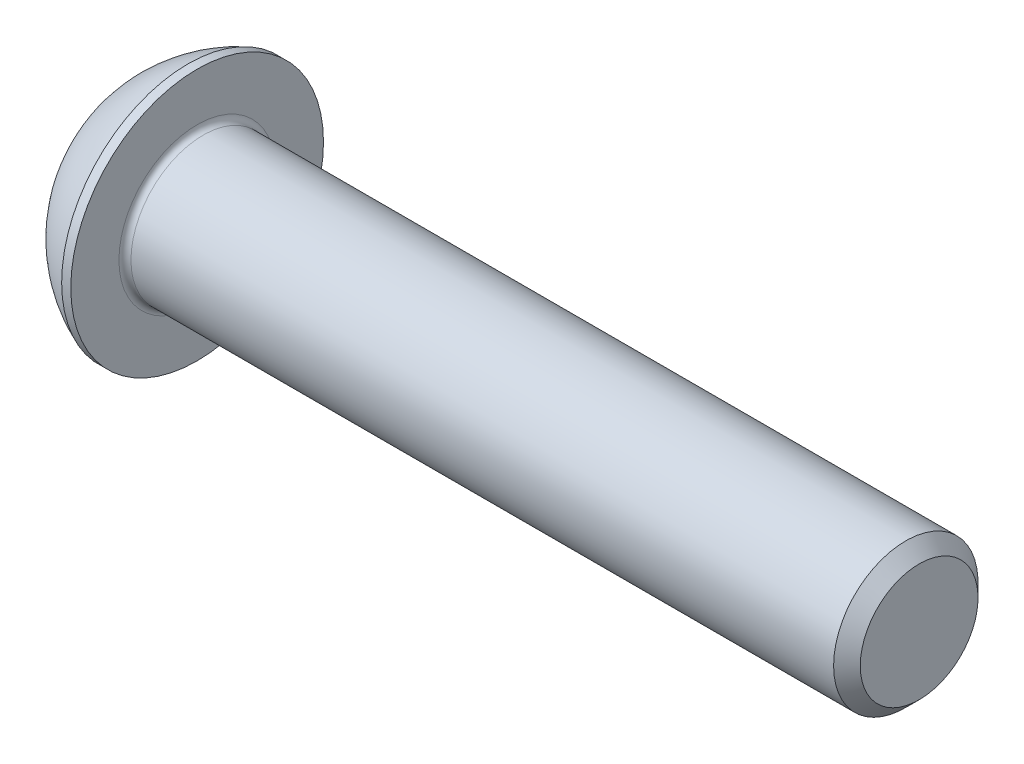
ISO-10303-21;
HEADER;
FILE_DESCRIPTION(('STEP AP214'),'2;1');
FILE_NAME('part.step','',(''),(''),'','','');
FILE_SCHEMA(('AUTOMOTIVE_DESIGN { 1 0 10303 214 1 1 1 1 }'));
ENDSEC;
DATA;
#1=APPLICATION_CONTEXT('core data for automotive mechanical design processes');
#2=APPLICATION_PROTOCOL_DEFINITION('international standard','automotive_design',2000,#1);
#3=PRODUCT_CONTEXT('',#1,'mechanical');
#4=PRODUCT('Part','Part','',(#3));
#5=PRODUCT_RELATED_PRODUCT_CATEGORY('part','',(#4));
#6=PRODUCT_DEFINITION_FORMATION('','',#4);
#7=PRODUCT_DEFINITION_CONTEXT('part definition',#1,'design');
#8=PRODUCT_DEFINITION('design','',#6,#7);
#9=PRODUCT_DEFINITION_SHAPE('','',#8);
#10=(LENGTH_UNIT() NAMED_UNIT(*) SI_UNIT(.MILLI.,.METRE.));
#11=(NAMED_UNIT(*) PLANE_ANGLE_UNIT() SI_UNIT($,.RADIAN.));
#12=(NAMED_UNIT(*) SI_UNIT($,.STERADIAN.) SOLID_ANGLE_UNIT());
#13=UNCERTAINTY_MEASURE_WITH_UNIT(LENGTH_MEASURE(1.E-05),#10,'distance_accuracy_value','');
#14=(GEOMETRIC_REPRESENTATION_CONTEXT(3) GLOBAL_UNCERTAINTY_ASSIGNED_CONTEXT((#13)) GLOBAL_UNIT_ASSIGNED_CONTEXT((#10,
#11,#12)) REPRESENTATION_CONTEXT('',''));
#15=CARTESIAN_POINT('',(0.,0.,0.));
#16=DIRECTION('',(0.,0.,1.));
#17=DIRECTION('',(1.,0.,0.));
#18=AXIS2_PLACEMENT_3D('',#15,#16,#17);
#19=CARTESIAN_POINT('',(0.,0.,0.));
#20=DIRECTION('',(-1.,0.,0.));
#21=DIRECTION('',(0.,0.,1.));
#22=AXIS2_PLACEMENT_3D('',#19,#20,#21);
#23=PLANE('',#22);
#24=CARTESIAN_POINT('',(0.,0.,0.));
#25=DIRECTION('',(-1.,0.,0.));
#26=DIRECTION('',(0.,0.,1.));
#27=AXIS2_PLACEMENT_3D('',#24,#25,#26);
#28=CIRCLE('',#27,2.625);
#29=CARTESIAN_POINT('',(0.,2.625,0.));
#30=VERTEX_POINT('',#29);
#31=EDGE_CURVE('E157',#30,#30,#28,.T.);
#32=ORIENTED_EDGE('',*,*,#31,.T.);
#33=EDGE_LOOP('',(#32));
#34=FACE_BOUND('',#33,.T.);
#35=DIRECTION('',(0.,-1.,0.));
#36=VECTOR('',#35,1.);
#37=CARTESIAN_POINT('',(0.,-1.15470053837925,2.));
#38=LINE('',#37,#36);
#39=CARTESIAN_POINT('',(0.,1.15470053837925,2.));
#40=VERTEX_POINT('',#39);
#41=CARTESIAN_POINT('',(0.,-1.15470053837925,2.));
#42=VERTEX_POINT('',#41);
#43=EDGE_CURVE('E52',#40,#42,#38,.T.);
#44=ORIENTED_EDGE('',*,*,#43,.T.);
#45=DIRECTION('',(0.,-0.5,-0.866025403784438));
#46=VECTOR('',#45,1.);
#47=CARTESIAN_POINT('',(0.,-2.3094010767585,0.));
#48=LINE('',#47,#46);
#49=CARTESIAN_POINT('',(0.,-2.3094010767585,0.));
#50=VERTEX_POINT('',#49);
#51=EDGE_CURVE('E277',#42,#50,#48,.T.);
#52=ORIENTED_EDGE('',*,*,#51,.T.);
#53=DIRECTION('',(0.,0.5,-0.866025403784438));
#54=VECTOR('',#53,1.);
#55=CARTESIAN_POINT('',(0.,-1.15470053837925,-2.));
#56=LINE('',#55,#54);
#57=CARTESIAN_POINT('',(0.,-1.15470053837925,-2.));
#58=VERTEX_POINT('',#57);
#59=EDGE_CURVE('E132',#50,#58,#56,.T.);
#60=ORIENTED_EDGE('',*,*,#59,.T.);
#61=DIRECTION('',(0.,1.,0.));
#62=VECTOR('',#61,1.);
#63=CARTESIAN_POINT('',(0.,1.15470053837925,-2.));
#64=LINE('',#63,#62);
#65=CARTESIAN_POINT('',(0.,1.15470053837925,-2.));
#66=VERTEX_POINT('',#65);
#67=EDGE_CURVE('E280',#58,#66,#64,.T.);
#68=ORIENTED_EDGE('',*,*,#67,.T.);
#69=DIRECTION('',(0.,0.5,0.866025403784439));
#70=VECTOR('',#69,1.);
#71=CARTESIAN_POINT('',(0.,2.3094010767585,0.));
#72=LINE('',#71,#70);
#73=CARTESIAN_POINT('',(0.,2.3094010767585,0.));
#74=VERTEX_POINT('',#73);
#75=EDGE_CURVE('E282',#66,#74,#72,.T.);
#76=ORIENTED_EDGE('',*,*,#75,.T.);
#77=DIRECTION('',(0.,-0.5,0.866025403784439));
#78=VECTOR('',#77,1.);
#79=CARTESIAN_POINT('',(0.,1.15470053837925,2.));
#80=LINE('',#79,#78);
#81=EDGE_CURVE('E284',#74,#40,#80,.T.);
#82=ORIENTED_EDGE('',*,*,#81,.T.);
#83=EDGE_LOOP('',(#44,#52,#60,#68,#76,#82));
#84=FACE_BOUND('',#83,.T.);
#85=ADVANCED_FACE('F37',(#34,#84),#23,.T.);
#86=CARTESIAN_POINT('',(4.99970462328768,0.,0.));
#87=DIRECTION('',(-1.,0.,0.));
#88=DIRECTION('',(0.,1.,0.));
#89=AXIS2_PLACEMENT_3D('',#86,#87,#88);
#90=SPHERICAL_SURFACE('',#89,5.64691697478581);
#91=CARTESIAN_POINT('',(2.92,0.,0.));
#92=DIRECTION('',(-1.,0.,0.));
#93=DIRECTION('',(0.,0.,1.));
#94=AXIS2_PLACEMENT_3D('',#91,#92,#93);
#95=CIRCLE('',#94,5.25);
#96=CARTESIAN_POINT('',(2.92,5.25,0.));
#97=VERTEX_POINT('',#96);
#98=EDGE_CURVE('E154',#97,#97,#95,.T.);
#99=CARTESIAN_POINT('',(2.92,5.25,0.));
#100=CARTESIAN_POINT('',(2.88116333139993,5.23461555496799,0.));
#101=CARTESIAN_POINT('',(2.84249743445724,5.21880002304115,0.));
#102=CARTESIAN_POINT('',(2.76552608609883,5.18631490596424,0.));
#103=CARTESIAN_POINT('',(2.72722063468312,5.16964532081416,0.));
#104=CARTESIAN_POINT('',(2.65098907959088,5.13546021785716,0.));
#105=CARTESIAN_POINT('',(2.61306297591435,5.11794470005024,0.));
#106=CARTESIAN_POINT('',(2.5376087841269,5.08207638165227,0.));
#107=CARTESIAN_POINT('',(2.50008069601598,5.06372358106122,0.));
#108=CARTESIAN_POINT('',(2.42544101991594,5.02618972911532,0.));
#109=CARTESIAN_POINT('',(2.38832943192683,5.00700867776048,0.));
#110=CARTESIAN_POINT('',(2.31454103209333,4.9678277722965,0.));
#111=CARTESIAN_POINT('',(2.27786422024896,4.94782791818736,0.));
#112=CARTESIAN_POINT('',(2.204963435524,4.90701925630078,0.));
#113=CARTESIAN_POINT('',(2.16873946264343,4.88621044852334,0.));
#114=CARTESIAN_POINT('',(2.09676219540546,4.84379412736126,0.));
#115=CARTESIAN_POINT('',(2.06100890104806,4.82218661397662,0.));
#116=CARTESIAN_POINT('',(1.9899905986814,4.77818352285276,0.));
#117=CARTESIAN_POINT('',(1.95472559067213,4.75578794511354,0.));
#118=CARTESIAN_POINT('',(1.88470122833741,4.7102197546814,0.));
#119=CARTESIAN_POINT('',(1.84994187401195,4.68704714198848,0.));
#120=CARTESIAN_POINT('',(1.78094593736053,4.63993629371345,0.));
#121=CARTESIAN_POINT('',(1.74670935503456,4.61599805813135,0.));
#122=CARTESIAN_POINT('',(1.67877582324134,4.56736775320002,0.));
#123=CARTESIAN_POINT('',(1.6450788737741,4.54267568385081,0.));
#124=CARTESIAN_POINT('',(1.57824120279908,4.4925498717552,0.));
#125=CARTESIAN_POINT('',(1.54510048129131,4.46711612900881,0.));
#126=CARTESIAN_POINT('',(1.4793915874043,4.4155194957489,0.));
#127=CARTESIAN_POINT('',(1.44682341502507,4.38935660523539,0.));
#128=CARTESIAN_POINT('',(1.3822756585948,4.33631456116252,0.));
#129=CARTESIAN_POINT('',(1.35029607454376,4.30943540760317,0.));
#130=CARTESIAN_POINT('',(1.28694124410103,4.2549740749057,0.));
#131=CARTESIAN_POINT('',(1.25556599770935,4.22739189576759,0.));
#132=CARTESIAN_POINT('',(1.19343529429185,4.17153809560631,0.));
#133=CARTESIAN_POINT('',(1.16267983726603,4.14326647458314,0.));
#134=CARTESIAN_POINT('',(1.10180385905236,4.0860477138823,0.));
#135=CARTESIAN_POINT('',(1.07168333786452,4.05710057420464,0.));
#136=CARTESIAN_POINT('',(1.01209206510523,3.99854503210539,0.));
#137=CARTESIAN_POINT('',(0.982621313533779,3.96893662968379,0.));
#138=CARTESIAN_POINT('',(0.924344093786626,3.90907314366641,0.));
#139=CARTESIAN_POINT('',(0.895537625610919,3.87881806007064,0.));
#140=CARTESIAN_POINT('',(0.838603159287822,3.8176761117527,0.));
#141=CARTESIAN_POINT('',(0.810475161140432,3.78678924703054,0.));
#142=CARTESIAN_POINT('',(0.754911487372878,3.72439894764781,0.));
#143=CARTESIAN_POINT('',(0.727475811752714,3.69289551298725,0.));
#144=CARTESIAN_POINT('',(0.673310294583733,3.62928758856414,0.));
#145=CARTESIAN_POINT('',(0.646580453034914,3.59718309880159,0.));
#146=CARTESIAN_POINT('',(0.593839767940169,3.53238887502059,0.));
#147=CARTESIAN_POINT('',(0.567828924394242,3.49969914100215,0.));
#148=CARTESIAN_POINT('',(0.516539045154726,3.43375052777114,0.));
#149=CARTESIAN_POINT('',(0.491260009461136,3.40049164855857,0.));
#150=CARTESIAN_POINT('',(0.441446195334815,3.33342112431611,0.));
#151=CARTESIAN_POINT('',(0.416911416902084,3.29960947928621,0.));
#152=CARTESIAN_POINT('',(0.368598200321404,3.23145007493057,0.));
#153=CARTESIAN_POINT('',(0.344819762173456,3.19710231560483,0.));
#154=CARTESIAN_POINT('',(0.298030936151543,3.12788759851044,0.));
#155=CARTESIAN_POINT('',(0.275020548277578,3.09302064074179,0.));
#156=CARTESIAN_POINT('',(0.229779156601617,3.02278469716988,0.));
#157=CARTESIAN_POINT('',(0.207548152799621,2.98741571136661,0.));
#158=CARTESIAN_POINT('',(0.163876471550352,2.91619313362712,0.));
#159=CARTESIAN_POINT('',(0.142435794103077,2.8803395416909,0.));
#160=CARTESIAN_POINT('',(0.100355347300805,2.80816539636944,0.));
#161=CARTESIAN_POINT('',(0.0797155779458075,2.7718448429842,0.));
#162=CARTESIAN_POINT('',(0.0392470276158929,2.69875470867178,0.));
#163=CARTESIAN_POINT('',(0.0194182466409761,2.66198512774461,0.));
#164=CARTESIAN_POINT('',(0.,2.625,0.));
#165=B_SPLINE_CURVE_WITH_KNOTS('',3,(#99,#100,#101,#102,#103,#104,#105,#106,#107,#108,#109,#110,
#111,#112,#113,#114,#115,#116,#117,#118,#119,#120,#121,#122,#123,#124,#125,#126,#127,#128,#129,
#130,#131,#132,#133,#134,#135,#136,#137,#138,#139,#140,#141,#142,#143,#144,#145,#146,#147,#148,
#149,#150,#151,#152,#153,#154,#155,#156,#157,#158,#159,#160,#161,#162,#163,#164),.UNSPECIFIED.,
.F.,.F.,(4,2,2,2,2,2,2,2,2,2,2,2,2,2,2,2,2,2,2,2,2,2,2,2,2,2,2,2,2,2,2,2,4),(0.,
0.12531586463099,0.25063172926198,0.37594759389297,0.50126345852396,0.62657932315495,
0.75189518778594,0.877211052416929,1.00252691704792,1.12784278167891,1.2531586463099,
1.37847451094089,1.50379037557188,1.62910624020287,1.75442210483386,1.87973796946485,
2.00505383409584,2.13036969872683,2.25568556335782,2.38100142798881,2.5063172926198,
2.63163315725079,2.75694902188178,2.88226488651277,3.00758075114376,3.13289661577475,
3.25821248040574,3.38352834503673,3.50884420966772,3.63416007429871,3.7594759389297,
3.88479180356069,4.01010766819168),.UNSPECIFIED.);
#166=EDGE_CURVE('BSEAM178',#97,#30,#165,.T.);
#167=ORIENTED_EDGE('',*,*,#98,.T.);
#168=ORIENTED_EDGE('',*,*,#31,.F.);
#169=ORIENTED_EDGE('',*,*,#166,.T.);
#170=ORIENTED_EDGE('',*,*,#166,.F.);
#171=EDGE_LOOP('',(#167,#169,#168,#170));
#172=FACE_BOUND('',#171,.T.);
#173=ADVANCED_FACE('F178',(#172),#90,.T.);
#174=CARTESIAN_POINT('',(0.,0.,0.));
#175=DIRECTION('',(-1.,0.,0.));
#176=DIRECTION('',(0.,0.,1.));
#177=AXIS2_PLACEMENT_3D('',#174,#175,#176);
#178=CYLINDRICAL_SURFACE('',#177,5.25);
#179=ORIENTED_EDGE('',*,*,#98,.F.);
#180=EDGE_LOOP('',(#179));
#181=FACE_BOUND('',#180,.T.);
#182=CARTESIAN_POINT('',(3.3,0.,0.));
#183=DIRECTION('',(-1.,0.,0.));
#184=DIRECTION('',(0.,0.,1.));
#185=AXIS2_PLACEMENT_3D('',#182,#183,#184);
#186=CIRCLE('',#185,5.25);
#187=CARTESIAN_POINT('',(3.3,0.,5.25));
#188=VERTEX_POINT('',#187);
#189=EDGE_CURVE('E151',#188,#188,#186,.T.);
#190=ORIENTED_EDGE('',*,*,#189,.T.);
#191=EDGE_LOOP('',(#190));
#192=FACE_BOUND('',#191,.T.);
#193=ADVANCED_FACE('F183',(#181,#192),#178,.T.);
#194=CARTESIAN_POINT('',(3.3,3.,0.));
#195=DIRECTION('',(-1.,0.,0.));
#196=DIRECTION('',(0.,0.,1.));
#197=AXIS2_PLACEMENT_3D('',#194,#195,#196);
#198=PLANE('',#197);
#199=CARTESIAN_POINT('',(3.3,0.,0.));
#200=DIRECTION('',(-1.,0.,0.));
#201=DIRECTION('',(0.,0.,1.));
#202=AXIS2_PLACEMENT_3D('',#199,#200,#201);
#203=CIRCLE('',#202,3.25);
#204=CARTESIAN_POINT('',(3.3,0.,3.25));
#205=VERTEX_POINT('',#204);
#206=EDGE_CURVE('E45',#205,#205,#203,.T.);
#207=ORIENTED_EDGE('',*,*,#206,.T.);
#208=EDGE_LOOP('',(#207));
#209=FACE_BOUND('',#208,.T.);
#210=ORIENTED_EDGE('',*,*,#189,.F.);
#211=EDGE_LOOP('',(#210));
#212=FACE_BOUND('',#211,.T.);
#213=ADVANCED_FACE('F162',(#209,#212),#198,.F.);
#214=CARTESIAN_POINT('',(0.,0.,0.));
#215=DIRECTION('',(-1.,0.,0.));
#216=DIRECTION('',(0.,0.,1.));
#217=AXIS2_PLACEMENT_3D('',#214,#215,#216);
#218=CYLINDRICAL_SURFACE('',#217,3.);
#219=CARTESIAN_POINT('',(3.55,0.,0.));
#220=DIRECTION('',(-1.,0.,0.));
#221=DIRECTION('',(0.,0.,1.));
#222=AXIS2_PLACEMENT_3D('',#219,#220,#221);
#223=CIRCLE('',#222,3.);
#224=CARTESIAN_POINT('',(3.55,0.,3.));
#225=VERTEX_POINT('',#224);
#226=EDGE_CURVE('E11',#225,#225,#223,.F.);
#227=ORIENTED_EDGE('',*,*,#226,.T.);
#228=EDGE_LOOP('',(#227));
#229=FACE_BOUND('',#228,.T.);
#230=CARTESIAN_POINT('',(32.7455,0.,0.));
#231=DIRECTION('',(-1.,0.,0.));
#232=DIRECTION('',(0.,0.,1.));
#233=AXIS2_PLACEMENT_3D('',#230,#231,#232);
#234=CIRCLE('',#233,3.);
#235=CARTESIAN_POINT('',(32.7455,0.,3.));
#236=VERTEX_POINT('',#235);
#237=EDGE_CURVE('E148',#236,#236,#234,.T.);
#238=ORIENTED_EDGE('',*,*,#237,.T.);
#239=EDGE_LOOP('',(#238));
#240=FACE_BOUND('',#239,.T.);
#241=ADVANCED_FACE('F192',(#229,#240),#218,.T.);
#242=CARTESIAN_POINT('',(33.3,0.,0.));
#243=DIRECTION('',(-1.,0.,0.));
#244=DIRECTION('',(0.,0.,1.));
#245=AXIS2_PLACEMENT_3D('',#242,#243,#244);
#246=CONICAL_SURFACE('',#245,2.4455,0.785398163397433);
#247=ORIENTED_EDGE('',*,*,#237,.F.);
#248=EDGE_LOOP('',(#247));
#249=FACE_BOUND('',#248,.T.);
#250=CARTESIAN_POINT('',(33.3,0.,0.));
#251=DIRECTION('',(-1.,0.,0.));
#252=DIRECTION('',(0.,0.,1.));
#253=AXIS2_PLACEMENT_3D('',#250,#251,#252);
#254=CIRCLE('',#253,2.4455);
#255=CARTESIAN_POINT('',(33.3,0.,2.4455));
#256=VERTEX_POINT('',#255);
#257=EDGE_CURVE('E144',#256,#256,#254,.T.);
#258=ORIENTED_EDGE('',*,*,#257,.T.);
#259=EDGE_LOOP('',(#258));
#260=FACE_BOUND('',#259,.T.);
#261=ADVANCED_FACE('F173',(#249,#260),#246,.T.);
#262=CARTESIAN_POINT('',(33.3,0.,0.));
#263=DIRECTION('',(-1.,0.,0.));
#264=DIRECTION('',(0.,0.,1.));
#265=AXIS2_PLACEMENT_3D('',#262,#263,#264);
#266=PLANE('',#265);
#267=ORIENTED_EDGE('',*,*,#257,.F.);
#268=EDGE_LOOP('',(#267));
#269=FACE_BOUND('',#268,.T.);
#270=ADVANCED_FACE('F166',(#269),#266,.F.);
#271=CARTESIAN_POINT('',(3.55,0.,0.));
#272=DIRECTION('',(-1.,0.,0.));
#273=DIRECTION('',(0.,0.,1.));
#274=AXIS2_PLACEMENT_3D('',#271,#272,#273);
#275=TOROIDAL_SURFACE('',#274,3.25,0.25);
#276=ORIENTED_EDGE('',*,*,#226,.F.);
#277=EDGE_LOOP('',(#276));
#278=FACE_BOUND('',#277,.T.);
#279=ORIENTED_EDGE('',*,*,#206,.F.);
#280=EDGE_LOOP('',(#279));
#281=FACE_BOUND('',#280,.T.);
#282=ADVANCED_FACE('F39',(#278,#281),#275,.F.);
#283=CARTESIAN_POINT('',(2.08,-2.3094010767585,0.));
#284=DIRECTION('',(0.,0.866025403784438,-0.500000000000001));
#285=DIRECTION('',(0.,0.500000000000001,0.866025403784438));
#286=AXIS2_PLACEMENT_3D('',#283,#284,#285);
#287=PLANE('',#286);
#288=DIRECTION('',(0.,-0.5,-0.866025403784438));
#289=VECTOR('',#288,1.);
#290=CARTESIAN_POINT('',(2.08,-2.3094010767585,0.));
#291=LINE('',#290,#289);
#292=CARTESIAN_POINT('',(2.08,-1.15470053837925,2.));
#293=VERTEX_POINT('',#292);
#294=CARTESIAN_POINT('',(2.08,-1.73205080756888,1.));
#295=VERTEX_POINT('',#294);
#296=EDGE_CURVE('E118',#293,#295,#291,.T.);
#297=ORIENTED_EDGE('',*,*,#296,.T.);
#298=CARTESIAN_POINT('',(2.08,-2.3094010767585,0.));
#299=VERTEX_POINT('',#298);
#300=EDGE_CURVE('E113',#295,#299,#291,.T.);
#301=ORIENTED_EDGE('',*,*,#300,.T.);
#302=DIRECTION('',(-1.,0.,0.));
#303=VECTOR('',#302,1.);
#304=CARTESIAN_POINT('',(2.08,-2.3094010767585,0.));
#305=LINE('',#304,#303);
#306=EDGE_CURVE('E115',#299,#50,#305,.T.);
#307=ORIENTED_EDGE('',*,*,#306,.T.);
#308=ORIENTED_EDGE('',*,*,#51,.F.);
#309=DIRECTION('',(-1.,0.,0.));
#310=VECTOR('',#309,1.);
#311=CARTESIAN_POINT('',(2.08,-1.15470053837925,2.));
#312=LINE('',#311,#310);
#313=EDGE_CURVE('E273',#293,#42,#312,.T.);
#314=ORIENTED_EDGE('',*,*,#313,.F.);
#315=EDGE_LOOP('',(#297,#301,#307,#308,#314));
#316=FACE_BOUND('',#315,.T.);
#317=ADVANCED_FACE('F114',(#316),#287,.T.);
#318=CARTESIAN_POINT('',(2.08,-1.15470053837925,-2.));
#319=DIRECTION('',(0.,0.866025403784438,0.5));
#320=DIRECTION('',(0.,-0.5,0.866025403784438));
#321=AXIS2_PLACEMENT_3D('',#318,#319,#320);
#322=PLANE('',#321);
#323=DIRECTION('',(0.,0.5,-0.866025403784438));
#324=VECTOR('',#323,1.);
#325=CARTESIAN_POINT('',(2.08,-1.15470053837925,-2.));
#326=LINE('',#325,#324);
#327=CARTESIAN_POINT('',(2.08,-1.73205080756888,-1.));
#328=VERTEX_POINT('',#327);
#329=EDGE_CURVE('E60',#299,#328,#326,.T.);
#330=ORIENTED_EDGE('',*,*,#329,.T.);
#331=CARTESIAN_POINT('',(2.08,-1.15470053837925,-2.));
#332=VERTEX_POINT('',#331);
#333=EDGE_CURVE('E127',#328,#332,#326,.T.);
#334=ORIENTED_EDGE('',*,*,#333,.T.);
#335=DIRECTION('',(-1.,0.,0.));
#336=VECTOR('',#335,1.);
#337=CARTESIAN_POINT('',(2.08,-1.15470053837925,-2.));
#338=LINE('',#337,#336);
#339=EDGE_CURVE('E134',#332,#58,#338,.T.);
#340=ORIENTED_EDGE('',*,*,#339,.T.);
#341=ORIENTED_EDGE('',*,*,#59,.F.);
#342=ORIENTED_EDGE('',*,*,#306,.F.);
#343=EDGE_LOOP('',(#330,#334,#340,#341,#342));
#344=FACE_BOUND('',#343,.T.);
#345=ADVANCED_FACE('F130',(#344),#322,.T.);
#346=CARTESIAN_POINT('',(2.08,1.15470053837925,-2.));
#347=DIRECTION('',(0.,0.,1.));
#348=DIRECTION('',(1.,0.,0.));
#349=AXIS2_PLACEMENT_3D('',#346,#347,#348);
#350=PLANE('',#349);
#351=DIRECTION('',(0.,1.,0.));
#352=VECTOR('',#351,1.);
#353=CARTESIAN_POINT('',(2.08,1.15470053837925,-2.));
#354=LINE('',#353,#352);
#355=CARTESIAN_POINT('',(2.08,0.,-2.));
#356=VERTEX_POINT('',#355);
#357=EDGE_CURVE('E254',#332,#356,#354,.T.);
#358=ORIENTED_EDGE('',*,*,#357,.T.);
#359=CARTESIAN_POINT('',(2.08,1.15470053837925,-2.));
#360=VERTEX_POINT('',#359);
#361=EDGE_CURVE('E126',#356,#360,#354,.T.);
#362=ORIENTED_EDGE('',*,*,#361,.T.);
#363=DIRECTION('',(-1.,0.,0.));
#364=VECTOR('',#363,1.);
#365=CARTESIAN_POINT('',(2.08,1.15470053837925,-2.));
#366=LINE('',#365,#364);
#367=EDGE_CURVE('E139',#360,#66,#366,.T.);
#368=ORIENTED_EDGE('',*,*,#367,.T.);
#369=ORIENTED_EDGE('',*,*,#67,.F.);
#370=ORIENTED_EDGE('',*,*,#339,.F.);
#371=EDGE_LOOP('',(#358,#362,#368,#369,#370));
#372=FACE_BOUND('',#371,.T.);
#373=ADVANCED_FACE('F206',(#372),#350,.T.);
#374=CARTESIAN_POINT('',(2.08,2.3094010767585,0.));
#375=DIRECTION('',(0.,-0.866025403784439,0.5));
#376=DIRECTION('',(0.,-0.5,-0.866025403784439));
#377=AXIS2_PLACEMENT_3D('',#374,#375,#376);
#378=PLANE('',#377);
#379=DIRECTION('',(0.,0.5,0.866025403784439));
#380=VECTOR('',#379,1.);
#381=CARTESIAN_POINT('',(2.08,2.3094010767585,0.));
#382=LINE('',#381,#380);
#383=CARTESIAN_POINT('',(2.08,1.73205080756888,-0.999999999999999));
#384=VERTEX_POINT('',#383);
#385=EDGE_CURVE('E243',#360,#384,#382,.T.);
#386=ORIENTED_EDGE('',*,*,#385,.T.);
#387=CARTESIAN_POINT('',(2.08,2.3094010767585,0.));
#388=VERTEX_POINT('',#387);
#389=EDGE_CURVE('E248',#384,#388,#382,.T.);
#390=ORIENTED_EDGE('',*,*,#389,.T.);
#391=DIRECTION('',(-1.,0.,0.));
#392=VECTOR('',#391,1.);
#393=CARTESIAN_POINT('',(2.08,2.3094010767585,0.));
#394=LINE('',#393,#392);
#395=EDGE_CURVE('E288',#388,#74,#394,.T.);
#396=ORIENTED_EDGE('',*,*,#395,.T.);
#397=ORIENTED_EDGE('',*,*,#75,.F.);
#398=ORIENTED_EDGE('',*,*,#367,.F.);
#399=EDGE_LOOP('',(#386,#390,#396,#397,#398));
#400=FACE_BOUND('',#399,.T.);
#401=ADVANCED_FACE('F209',(#400),#378,.T.);
#402=CARTESIAN_POINT('',(2.08,1.15470053837925,2.));
#403=DIRECTION('',(0.,-0.866025403784439,-0.5));
#404=DIRECTION('',(0.,0.5,-0.866025403784439));
#405=AXIS2_PLACEMENT_3D('',#402,#403,#404);
#406=PLANE('',#405);
#407=DIRECTION('',(0.,-0.5,0.866025403784439));
#408=VECTOR('',#407,1.);
#409=CARTESIAN_POINT('',(2.08,1.15470053837925,2.));
#410=LINE('',#409,#408);
#411=CARTESIAN_POINT('',(2.08,1.73205080756888,0.999999999999999));
#412=VERTEX_POINT('',#411);
#413=EDGE_CURVE('E251',#388,#412,#410,.T.);
#414=ORIENTED_EDGE('',*,*,#413,.T.);
#415=CARTESIAN_POINT('',(2.08,1.15470053837925,2.));
#416=VERTEX_POINT('',#415);
#417=EDGE_CURVE('E259',#412,#416,#410,.T.);
#418=ORIENTED_EDGE('',*,*,#417,.T.);
#419=DIRECTION('',(-1.,0.,0.));
#420=VECTOR('',#419,1.);
#421=CARTESIAN_POINT('',(2.08,1.15470053837925,2.));
#422=LINE('',#421,#420);
#423=EDGE_CURVE('E272',#416,#40,#422,.T.);
#424=ORIENTED_EDGE('',*,*,#423,.T.);
#425=ORIENTED_EDGE('',*,*,#81,.F.);
#426=ORIENTED_EDGE('',*,*,#395,.F.);
#427=EDGE_LOOP('',(#414,#418,#424,#425,#426));
#428=FACE_BOUND('',#427,.T.);
#429=ADVANCED_FACE('F213',(#428),#406,.T.);
#430=CARTESIAN_POINT('',(2.08,-1.15470053837925,2.));
#431=DIRECTION('',(0.,0.,-1.));
#432=DIRECTION('',(-1.,0.,0.));
#433=AXIS2_PLACEMENT_3D('',#430,#431,#432);
#434=PLANE('',#433);
#435=DIRECTION('',(0.,-1.,0.));
#436=VECTOR('',#435,1.);
#437=CARTESIAN_POINT('',(2.08,-1.15470053837925,2.));
#438=LINE('',#437,#436);
#439=CARTESIAN_POINT('',(2.08,0.,2.));
#440=VERTEX_POINT('',#439);
#441=EDGE_CURVE('E265',#416,#440,#438,.T.);
#442=ORIENTED_EDGE('',*,*,#441,.T.);
#443=EDGE_CURVE('E267',#440,#293,#438,.T.);
#444=ORIENTED_EDGE('',*,*,#443,.T.);
#445=ORIENTED_EDGE('',*,*,#313,.T.);
#446=ORIENTED_EDGE('',*,*,#43,.F.);
#447=ORIENTED_EDGE('',*,*,#423,.F.);
#448=EDGE_LOOP('',(#442,#444,#445,#446,#447));
#449=FACE_BOUND('',#448,.T.);
#450=ADVANCED_FACE('F217',(#449),#434,.T.);
#451=CARTESIAN_POINT('',(2.08,-2.3094010767585,0.));
#452=DIRECTION('',(1.,0.,0.));
#453=DIRECTION('',(0.,0.,-1.));
#454=AXIS2_PLACEMENT_3D('',#451,#452,#453);
#455=PLANE('',#454);
#456=CARTESIAN_POINT('',(2.08,0.,0.));
#457=DIRECTION('',(-1.,0.,0.));
#458=DIRECTION('',(0.,0.,1.));
#459=AXIS2_PLACEMENT_3D('',#456,#457,#458);
#460=CIRCLE('',#459,2.);
#461=EDGE_CURVE('E240',#384,#356,#460,.T.);
#462=ORIENTED_EDGE('',*,*,#461,.F.);
#463=ORIENTED_EDGE('',*,*,#385,.F.);
#464=ORIENTED_EDGE('',*,*,#361,.F.);
#465=EDGE_LOOP('',(#462,#463,#464));
#466=FACE_BOUND('',#465,.T.);
#467=ADVANCED_FACE('F221',(#466),#455,.F.);
#468=EDGE_CURVE('E145',#412,#384,#460,.T.);
#469=ORIENTED_EDGE('',*,*,#468,.F.);
#470=ORIENTED_EDGE('',*,*,#413,.F.);
#471=ORIENTED_EDGE('',*,*,#389,.F.);
#472=EDGE_LOOP('',(#469,#470,#471));
#473=FACE_BOUND('',#472,.T.);
#474=ADVANCED_FACE('F230',(#473),#455,.F.);
#475=EDGE_CURVE('E138',#440,#412,#460,.T.);
#476=ORIENTED_EDGE('',*,*,#475,.F.);
#477=ORIENTED_EDGE('',*,*,#441,.F.);
#478=ORIENTED_EDGE('',*,*,#417,.F.);
#479=EDGE_LOOP('',(#476,#477,#478));
#480=FACE_BOUND('',#479,.T.);
#481=ADVANCED_FACE('F235',(#480),#455,.F.);
#482=EDGE_CURVE('E133',#295,#440,#460,.T.);
#483=ORIENTED_EDGE('',*,*,#482,.F.);
#484=ORIENTED_EDGE('',*,*,#296,.F.);
#485=ORIENTED_EDGE('',*,*,#443,.F.);
#486=EDGE_LOOP('',(#483,#484,#485));
#487=FACE_BOUND('',#486,.T.);
#488=ADVANCED_FACE('F228',(#487),#455,.F.);
#489=EDGE_CURVE('E124',#328,#295,#460,.T.);
#490=ORIENTED_EDGE('',*,*,#489,.F.);
#491=ORIENTED_EDGE('',*,*,#329,.F.);
#492=ORIENTED_EDGE('',*,*,#300,.F.);
#493=EDGE_LOOP('',(#490,#491,#492));
#494=FACE_BOUND('',#493,.T.);
#495=ADVANCED_FACE('F123',(#494),#455,.F.);
#496=EDGE_CURVE('E246',#356,#328,#460,.T.);
#497=ORIENTED_EDGE('',*,*,#496,.F.);
#498=ORIENTED_EDGE('',*,*,#357,.F.);
#499=ORIENTED_EDGE('',*,*,#333,.F.);
#500=EDGE_LOOP('',(#497,#498,#499));
#501=FACE_BOUND('',#500,.T.);
#502=ADVANCED_FACE('F201',(#501),#455,.F.);
#503=CARTESIAN_POINT('',(3.23470053837926,0.,0.));
#504=DIRECTION('',(-1.,0.,0.));
#505=DIRECTION('',(0.,0.,1.));
#506=AXIS2_PLACEMENT_3D('',#503,#504,#505);
#507=CONICAL_SURFACE('',#506,0.,1.04719755119659);
#508=ORIENTED_EDGE('',*,*,#475,.T.);
#509=ORIENTED_EDGE('',*,*,#468,.T.);
#510=ORIENTED_EDGE('',*,*,#461,.T.);
#511=ORIENTED_EDGE('',*,*,#496,.T.);
#512=ORIENTED_EDGE('',*,*,#489,.T.);
#513=ORIENTED_EDGE('',*,*,#482,.T.);
#514=EDGE_LOOP('',(#508,#509,#510,#511,#512,#513));
#515=FACE_BOUND('',#514,.T.);
#516=CARTESIAN_POINT('',(3.23470053837926,0.,0.));
#517=VERTEX_POINT('',#516);
#518=VERTEX_LOOP('',#517);
#519=FACE_BOUND('',#518,.T.);
#520=ADVANCED_FACE('F199',(#515,#519),#507,.F.);
#521=CLOSED_SHELL('',(#85,#173,#193,#213,#241,#261,#270,#282,#317,#345,#373,#401,#429,#450,#467,
#474,#481,#488,#495,#502,#520));
#522=MANIFOLD_SOLID_BREP('B2',#521);
#523=ADVANCED_BREP_SHAPE_REPRESENTATION('',(#18,#522),#14);
#524=SHAPE_DEFINITION_REPRESENTATION(#9,#523);
ENDSEC;
END-ISO-10303-21;
